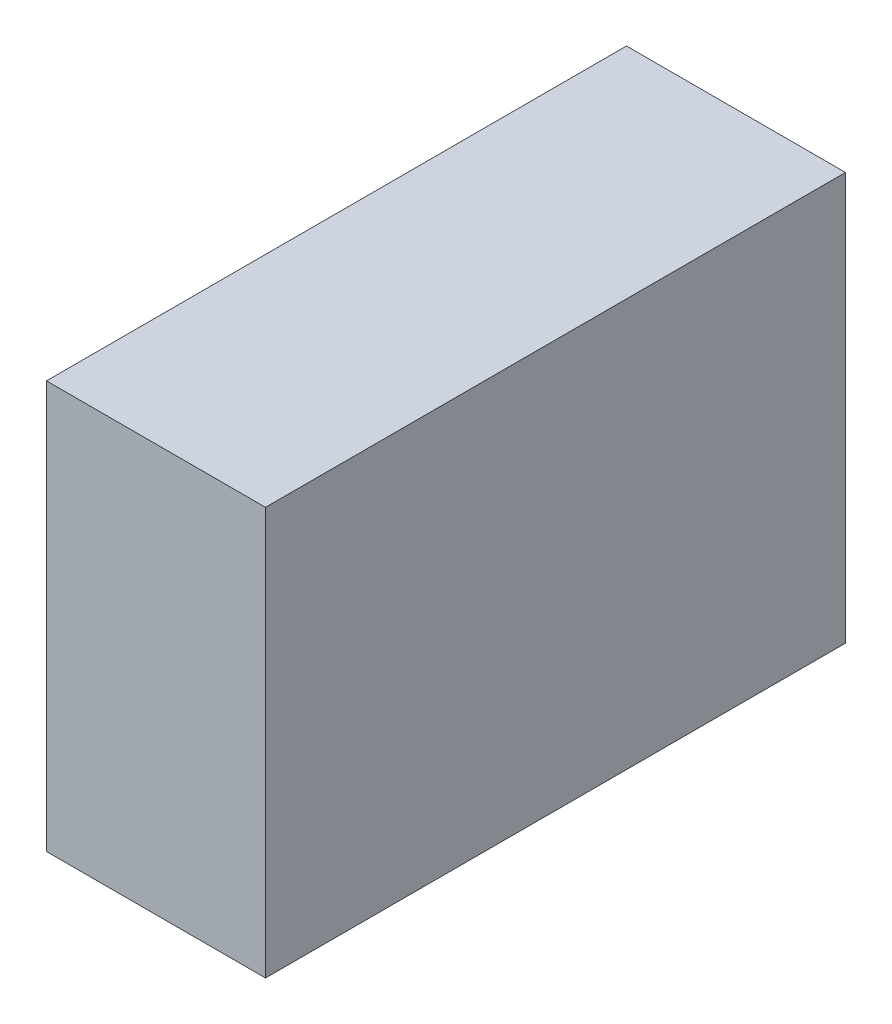
ISO-10303-21;
HEADER;
FILE_DESCRIPTION(('STEP AP214'),'2;1');
FILE_NAME('part.step','',(''),(''),'','','');
FILE_SCHEMA(('AUTOMOTIVE_DESIGN { 1 0 10303 214 1 1 1 1 }'));
ENDSEC;
DATA;
#1=APPLICATION_CONTEXT('core data for automotive mechanical design processes');
#2=APPLICATION_PROTOCOL_DEFINITION('international standard','automotive_design',2000,#1);
#3=PRODUCT_CONTEXT('',#1,'mechanical');
#4=PRODUCT('Part','Part','',(#3));
#5=PRODUCT_RELATED_PRODUCT_CATEGORY('part','',(#4));
#6=PRODUCT_DEFINITION_FORMATION('','',#4);
#7=PRODUCT_DEFINITION_CONTEXT('part definition',#1,'design');
#8=PRODUCT_DEFINITION('design','',#6,#7);
#9=PRODUCT_DEFINITION_SHAPE('','',#8);
#10=(LENGTH_UNIT() NAMED_UNIT(*) SI_UNIT(.MILLI.,.METRE.));
#11=(NAMED_UNIT(*) PLANE_ANGLE_UNIT() SI_UNIT($,.RADIAN.));
#12=(NAMED_UNIT(*) SI_UNIT($,.STERADIAN.) SOLID_ANGLE_UNIT());
#13=UNCERTAINTY_MEASURE_WITH_UNIT(LENGTH_MEASURE(1.E-05),#10,'distance_accuracy_value','');
#14=(GEOMETRIC_REPRESENTATION_CONTEXT(3) GLOBAL_UNCERTAINTY_ASSIGNED_CONTEXT((#13)) GLOBAL_UNIT_ASSIGNED_CONTEXT((#10,
#11,#12)) REPRESENTATION_CONTEXT('',''));
#15=CARTESIAN_POINT('',(0.,0.,0.));
#16=DIRECTION('',(0.,0.,1.));
#17=DIRECTION('',(1.,0.,0.));
#18=AXIS2_PLACEMENT_3D('',#15,#16,#17);
#19=CARTESIAN_POINT('',(0.,319.0875,0.));
#20=DIRECTION('',(1.,0.,0.));
#21=DIRECTION('',(0.,0.,-1.));
#22=AXIS2_PLACEMENT_3D('',#19,#20,#21);
#23=PLANE('',#22);
#24=DIRECTION('',(0.,0.,1.));
#25=VECTOR('',#24,1.);
#26=CARTESIAN_POINT('',(0.,0.,0.));
#27=LINE('',#26,#25);
#28=CARTESIAN_POINT('',(0.,0.,-454.025));
#29=VERTEX_POINT('',#28);
#30=CARTESIAN_POINT('',(0.,0.,0.));
#31=VERTEX_POINT('',#30);
#32=EDGE_CURVE('E105',#29,#31,#27,.T.);
#33=ORIENTED_EDGE('',*,*,#32,.T.);
#34=DIRECTION('',(0.,-1.,0.));
#35=VECTOR('',#34,1.);
#36=CARTESIAN_POINT('',(0.,319.0875,0.));
#37=LINE('',#36,#35);
#38=CARTESIAN_POINT('',(0.,319.0875,0.));
#39=VERTEX_POINT('',#38);
#40=EDGE_CURVE('E11',#39,#31,#37,.T.);
#41=ORIENTED_EDGE('',*,*,#40,.F.);
#42=DIRECTION('',(0.,0.,1.));
#43=VECTOR('',#42,1.);
#44=CARTESIAN_POINT('',(0.,319.0875,0.));
#45=LINE('',#44,#43);
#46=CARTESIAN_POINT('',(0.,319.0875,-454.025));
#47=VERTEX_POINT('',#46);
#48=EDGE_CURVE('E89',#47,#39,#45,.T.);
#49=ORIENTED_EDGE('',*,*,#48,.F.);
#50=DIRECTION('',(0.,-1.,0.));
#51=VECTOR('',#50,1.);
#52=CARTESIAN_POINT('',(0.,319.0875,-454.025));
#53=LINE('',#52,#51);
#54=EDGE_CURVE('E98',#47,#29,#53,.T.);
#55=ORIENTED_EDGE('',*,*,#54,.T.);
#56=EDGE_LOOP('',(#33,#41,#49,#55));
#57=FACE_BOUND('',#56,.T.);
#58=ADVANCED_FACE('F39',(#57),#23,.F.);
#59=CARTESIAN_POINT('',(0.,319.0875,0.));
#60=DIRECTION('',(0.,0.,-1.));
#61=DIRECTION('',(-1.,0.,0.));
#62=AXIS2_PLACEMENT_3D('',#59,#60,#61);
#63=PLANE('',#62);
#64=DIRECTION('',(1.,0.,0.));
#65=VECTOR('',#64,1.);
#66=CARTESIAN_POINT('',(0.,0.,0.));
#67=LINE('',#66,#65);
#68=CARTESIAN_POINT('',(171.45,0.,0.));
#69=VERTEX_POINT('',#68);
#70=EDGE_CURVE('E94',#31,#69,#67,.T.);
#71=ORIENTED_EDGE('',*,*,#70,.T.);
#72=DIRECTION('',(0.,-1.,0.));
#73=VECTOR('',#72,1.);
#74=CARTESIAN_POINT('',(171.45,319.0875,0.));
#75=LINE('',#74,#73);
#76=CARTESIAN_POINT('',(171.45,319.0875,0.));
#77=VERTEX_POINT('',#76);
#78=EDGE_CURVE('E50',#77,#69,#75,.T.);
#79=ORIENTED_EDGE('',*,*,#78,.F.);
#80=DIRECTION('',(1.,0.,0.));
#81=VECTOR('',#80,1.);
#82=CARTESIAN_POINT('',(0.,319.0875,0.));
#83=LINE('',#82,#81);
#84=EDGE_CURVE('E84',#39,#77,#83,.T.);
#85=ORIENTED_EDGE('',*,*,#84,.F.);
#86=ORIENTED_EDGE('',*,*,#40,.T.);
#87=EDGE_LOOP('',(#71,#79,#85,#86));
#88=FACE_BOUND('',#87,.T.);
#89=ADVANCED_FACE('F91',(#88),#63,.F.);
#90=CARTESIAN_POINT('',(171.45,319.0875,0.));
#91=DIRECTION('',(-1.,0.,0.));
#92=DIRECTION('',(0.,0.,1.));
#93=AXIS2_PLACEMENT_3D('',#90,#91,#92);
#94=PLANE('',#93);
#95=DIRECTION('',(0.,0.,-1.));
#96=VECTOR('',#95,1.);
#97=CARTESIAN_POINT('',(171.45,0.,0.));
#98=LINE('',#97,#96);
#99=CARTESIAN_POINT('',(171.45,0.,-454.025));
#100=VERTEX_POINT('',#99);
#101=EDGE_CURVE('E75',#69,#100,#98,.T.);
#102=ORIENTED_EDGE('',*,*,#101,.T.);
#103=DIRECTION('',(0.,-1.,0.));
#104=VECTOR('',#103,1.);
#105=CARTESIAN_POINT('',(171.45,319.0875,-454.025));
#106=LINE('',#105,#104);
#107=CARTESIAN_POINT('',(171.45,319.0875,-454.025));
#108=VERTEX_POINT('',#107);
#109=EDGE_CURVE('E92',#108,#100,#106,.T.);
#110=ORIENTED_EDGE('',*,*,#109,.F.);
#111=DIRECTION('',(0.,0.,-1.));
#112=VECTOR('',#111,1.);
#113=CARTESIAN_POINT('',(171.45,319.0875,0.));
#114=LINE('',#113,#112);
#115=EDGE_CURVE('E86',#77,#108,#114,.T.);
#116=ORIENTED_EDGE('',*,*,#115,.F.);
#117=ORIENTED_EDGE('',*,*,#78,.T.);
#118=EDGE_LOOP('',(#102,#110,#116,#117));
#119=FACE_BOUND('',#118,.T.);
#120=ADVANCED_FACE('F96',(#119),#94,.F.);
#121=CARTESIAN_POINT('',(0.,319.0875,-454.025));
#122=DIRECTION('',(0.,0.,1.));
#123=DIRECTION('',(1.,0.,0.));
#124=AXIS2_PLACEMENT_3D('',#121,#122,#123);
#125=PLANE('',#124);
#126=DIRECTION('',(-1.,0.,0.));
#127=VECTOR('',#126,1.);
#128=CARTESIAN_POINT('',(0.,0.,-454.025));
#129=LINE('',#128,#127);
#130=EDGE_CURVE('E79',#100,#29,#129,.T.);
#131=ORIENTED_EDGE('',*,*,#130,.T.);
#132=ORIENTED_EDGE('',*,*,#54,.F.);
#133=DIRECTION('',(-1.,0.,0.));
#134=VECTOR('',#133,1.);
#135=CARTESIAN_POINT('',(0.,319.0875,-454.025));
#136=LINE('',#135,#134);
#137=EDGE_CURVE('E54',#108,#47,#136,.T.);
#138=ORIENTED_EDGE('',*,*,#137,.F.);
#139=ORIENTED_EDGE('',*,*,#109,.T.);
#140=EDGE_LOOP('',(#131,#132,#138,#139));
#141=FACE_BOUND('',#140,.T.);
#142=ADVANCED_FACE('F108',(#141),#125,.F.);
#143=CARTESIAN_POINT('',(0.,319.0875,0.));
#144=DIRECTION('',(0.,-1.,0.));
#145=DIRECTION('',(0.,0.,-1.));
#146=AXIS2_PLACEMENT_3D('',#143,#144,#145);
#147=PLANE('',#146);
#148=ORIENTED_EDGE('',*,*,#48,.T.);
#149=ORIENTED_EDGE('',*,*,#84,.T.);
#150=ORIENTED_EDGE('',*,*,#115,.T.);
#151=ORIENTED_EDGE('',*,*,#137,.T.);
#152=EDGE_LOOP('',(#148,#149,#150,#151));
#153=FACE_BOUND('',#152,.T.);
#154=ADVANCED_FACE('F88',(#153),#147,.F.);
#155=CARTESIAN_POINT('',(0.,0.,0.));
#156=DIRECTION('',(0.,-1.,0.));
#157=DIRECTION('',(0.,0.,-1.));
#158=AXIS2_PLACEMENT_3D('',#155,#156,#157);
#159=PLANE('',#158);
#160=ORIENTED_EDGE('',*,*,#32,.F.);
#161=ORIENTED_EDGE('',*,*,#130,.F.);
#162=ORIENTED_EDGE('',*,*,#101,.F.);
#163=ORIENTED_EDGE('',*,*,#70,.F.);
#164=EDGE_LOOP('',(#160,#161,#162,#163));
#165=FACE_BOUND('',#164,.T.);
#166=ADVANCED_FACE('F115',(#165),#159,.T.);
#167=CLOSED_SHELL('',(#58,#89,#120,#142,#154,#166));
#168=MANIFOLD_SOLID_BREP('B2',#167);
#169=ADVANCED_BREP_SHAPE_REPRESENTATION('',(#18,#168),#14);
#170=SHAPE_DEFINITION_REPRESENTATION(#9,#169);
ENDSEC;
END-ISO-10303-21;
